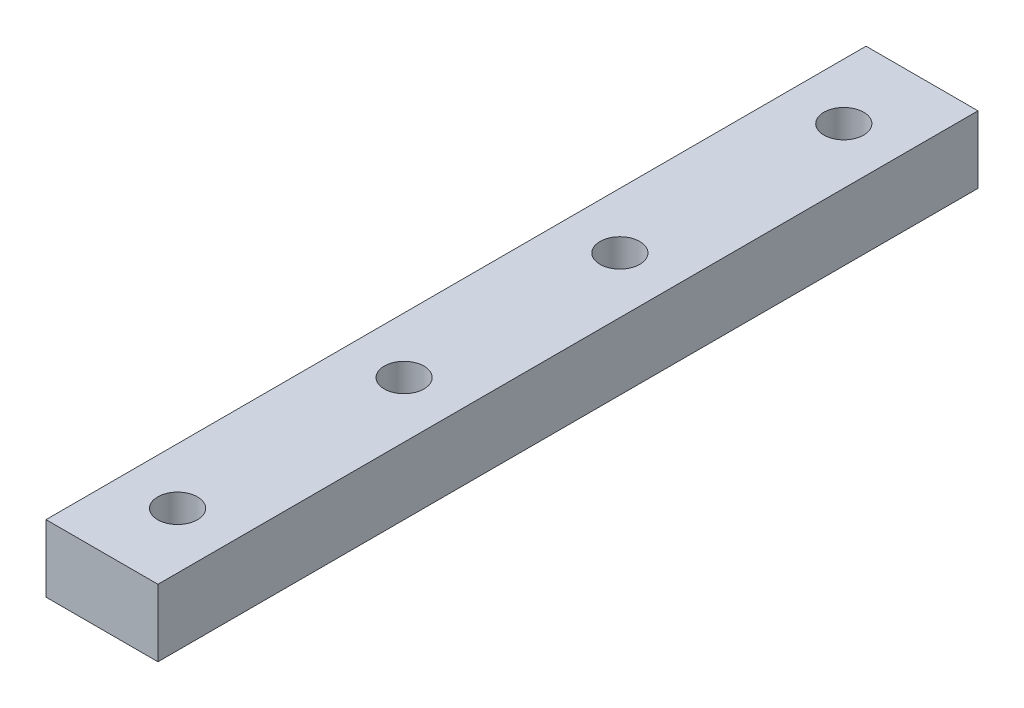
ISO-10303-21;
HEADER;
FILE_DESCRIPTION(('STEP AP214'),'2;1');
FILE_NAME('part.step','',(''),(''),'','','');
FILE_SCHEMA(('AUTOMOTIVE_DESIGN { 1 0 10303 214 1 1 1 1 }'));
ENDSEC;
DATA;
#1=APPLICATION_CONTEXT('core data for automotive mechanical design processes');
#2=APPLICATION_PROTOCOL_DEFINITION('international standard','automotive_design',2000,#1);
#3=PRODUCT_CONTEXT('',#1,'mechanical');
#4=PRODUCT('Part','Part','',(#3));
#5=PRODUCT_RELATED_PRODUCT_CATEGORY('part','',(#4));
#6=PRODUCT_DEFINITION_FORMATION('','',#4);
#7=PRODUCT_DEFINITION_CONTEXT('part definition',#1,'design');
#8=PRODUCT_DEFINITION('design','',#6,#7);
#9=PRODUCT_DEFINITION_SHAPE('','',#8);
#10=(LENGTH_UNIT() NAMED_UNIT(*) SI_UNIT(.MILLI.,.METRE.));
#11=(NAMED_UNIT(*) PLANE_ANGLE_UNIT() SI_UNIT($,.RADIAN.));
#12=(NAMED_UNIT(*) SI_UNIT($,.STERADIAN.) SOLID_ANGLE_UNIT());
#13=UNCERTAINTY_MEASURE_WITH_UNIT(LENGTH_MEASURE(1.E-05),#10,'distance_accuracy_value','');
#14=(GEOMETRIC_REPRESENTATION_CONTEXT(3) GLOBAL_UNCERTAINTY_ASSIGNED_CONTEXT((#13)) GLOBAL_UNIT_ASSIGNED_CONTEXT((#10,
#11,#12)) REPRESENTATION_CONTEXT('',''));
#15=CARTESIAN_POINT('',(0.,0.,0.));
#16=DIRECTION('',(0.,0.,1.));
#17=DIRECTION('',(1.,0.,0.));
#18=AXIS2_PLACEMENT_3D('',#15,#16,#17);
#19=CARTESIAN_POINT('',(-10.,12.,-73.25));
#20=DIRECTION('',(1.,0.,0.));
#21=DIRECTION('',(0.,0.,-1.));
#22=AXIS2_PLACEMENT_3D('',#19,#20,#21);
#23=PLANE('',#22);
#24=DIRECTION('',(0.,0.,1.));
#25=VECTOR('',#24,1.);
#26=CARTESIAN_POINT('',(-10.,0.,-73.25));
#27=LINE('',#26,#25);
#28=CARTESIAN_POINT('',(-10.,0.,-73.25));
#29=VERTEX_POINT('',#28);
#30=CARTESIAN_POINT('',(-9.99999999999999,0.,73.25));
#31=VERTEX_POINT('',#30);
#32=EDGE_CURVE('E97',#29,#31,#27,.T.);
#33=ORIENTED_EDGE('',*,*,#32,.T.);
#34=DIRECTION('',(0.,-1.,0.));
#35=VECTOR('',#34,1.);
#36=CARTESIAN_POINT('',(-9.99999999999999,12.,73.25));
#37=LINE('',#36,#35);
#38=CARTESIAN_POINT('',(-9.99999999999999,12.,73.25));
#39=VERTEX_POINT('',#38);
#40=EDGE_CURVE('E11',#39,#31,#37,.T.);
#41=ORIENTED_EDGE('',*,*,#40,.F.);
#42=DIRECTION('',(0.,0.,1.));
#43=VECTOR('',#42,1.);
#44=CARTESIAN_POINT('',(-10.,12.,-73.25));
#45=LINE('',#44,#43);
#46=CARTESIAN_POINT('',(-10.,12.,-73.25));
#47=VERTEX_POINT('',#46);
#48=EDGE_CURVE('E85',#47,#39,#45,.T.);
#49=ORIENTED_EDGE('',*,*,#48,.F.);
#50=DIRECTION('',(0.,-1.,0.));
#51=VECTOR('',#50,1.);
#52=CARTESIAN_POINT('',(-10.,12.,-73.25));
#53=LINE('',#52,#51);
#54=EDGE_CURVE('E93',#47,#29,#53,.T.);
#55=ORIENTED_EDGE('',*,*,#54,.T.);
#56=EDGE_LOOP('',(#33,#41,#49,#55));
#57=FACE_BOUND('',#56,.T.);
#58=ADVANCED_FACE('F34',(#57),#23,.F.);
#59=CARTESIAN_POINT('',(-9.99999999999999,12.,73.25));
#60=DIRECTION('',(0.,0.,-1.));
#61=DIRECTION('',(-1.,0.,0.));
#62=AXIS2_PLACEMENT_3D('',#59,#60,#61);
#63=PLANE('',#62);
#64=DIRECTION('',(1.,0.,0.));
#65=VECTOR('',#64,1.);
#66=CARTESIAN_POINT('',(-9.99999999999999,0.,73.25));
#67=LINE('',#66,#65);
#68=CARTESIAN_POINT('',(10.,0.,73.25));
#69=VERTEX_POINT('',#68);
#70=EDGE_CURVE('E89',#31,#69,#67,.T.);
#71=ORIENTED_EDGE('',*,*,#70,.T.);
#72=DIRECTION('',(0.,-1.,0.));
#73=VECTOR('',#72,1.);
#74=CARTESIAN_POINT('',(10.,12.,73.25));
#75=LINE('',#74,#73);
#76=CARTESIAN_POINT('',(10.,12.,73.25));
#77=VERTEX_POINT('',#76);
#78=EDGE_CURVE('E42',#77,#69,#75,.T.);
#79=ORIENTED_EDGE('',*,*,#78,.F.);
#80=DIRECTION('',(1.,0.,0.));
#81=VECTOR('',#80,1.);
#82=CARTESIAN_POINT('',(-9.99999999999999,12.,73.25));
#83=LINE('',#82,#81);
#84=EDGE_CURVE('E80',#39,#77,#83,.T.);
#85=ORIENTED_EDGE('',*,*,#84,.F.);
#86=ORIENTED_EDGE('',*,*,#40,.T.);
#87=EDGE_LOOP('',(#71,#79,#85,#86));
#88=FACE_BOUND('',#87,.T.);
#89=ADVANCED_FACE('F88',(#88),#63,.F.);
#90=CARTESIAN_POINT('',(9.99999999999999,12.,-73.25));
#91=DIRECTION('',(-1.,0.,0.));
#92=DIRECTION('',(0.,0.,1.));
#93=AXIS2_PLACEMENT_3D('',#90,#91,#92);
#94=PLANE('',#93);
#95=DIRECTION('',(0.,0.,-1.));
#96=VECTOR('',#95,1.);
#97=CARTESIAN_POINT('',(9.99999999999999,0.,-73.25));
#98=LINE('',#97,#96);
#99=CARTESIAN_POINT('',(9.99999999999999,0.,-73.25));
#100=VERTEX_POINT('',#99);
#101=EDGE_CURVE('E67',#69,#100,#98,.T.);
#102=ORIENTED_EDGE('',*,*,#101,.T.);
#103=DIRECTION('',(0.,-1.,0.));
#104=VECTOR('',#103,1.);
#105=CARTESIAN_POINT('',(9.99999999999999,12.,-73.25));
#106=LINE('',#105,#104);
#107=CARTESIAN_POINT('',(9.99999999999999,12.,-73.25));
#108=VERTEX_POINT('',#107);
#109=EDGE_CURVE('E90',#108,#100,#106,.T.);
#110=ORIENTED_EDGE('',*,*,#109,.F.);
#111=DIRECTION('',(0.,0.,-1.));
#112=VECTOR('',#111,1.);
#113=CARTESIAN_POINT('',(9.99999999999999,12.,-73.25));
#114=LINE('',#113,#112);
#115=EDGE_CURVE('E83',#77,#108,#114,.T.);
#116=ORIENTED_EDGE('',*,*,#115,.F.);
#117=ORIENTED_EDGE('',*,*,#78,.T.);
#118=EDGE_LOOP('',(#102,#110,#116,#117));
#119=FACE_BOUND('',#118,.T.);
#120=ADVANCED_FACE('F91',(#119),#94,.F.);
#121=CARTESIAN_POINT('',(-10.,12.,-73.25));
#122=DIRECTION('',(0.,0.,1.));
#123=DIRECTION('',(1.,0.,0.));
#124=AXIS2_PLACEMENT_3D('',#121,#122,#123);
#125=PLANE('',#124);
#126=DIRECTION('',(-1.,0.,0.));
#127=VECTOR('',#126,1.);
#128=CARTESIAN_POINT('',(-10.,0.,-73.25));
#129=LINE('',#128,#127);
#130=EDGE_CURVE('E73',#100,#29,#129,.T.);
#131=ORIENTED_EDGE('',*,*,#130,.T.);
#132=ORIENTED_EDGE('',*,*,#54,.F.);
#133=DIRECTION('',(-1.,0.,0.));
#134=VECTOR('',#133,1.);
#135=CARTESIAN_POINT('',(-10.,12.,-73.25));
#136=LINE('',#135,#134);
#137=EDGE_CURVE('E50',#108,#47,#136,.T.);
#138=ORIENTED_EDGE('',*,*,#137,.F.);
#139=ORIENTED_EDGE('',*,*,#109,.T.);
#140=EDGE_LOOP('',(#131,#132,#138,#139));
#141=FACE_BOUND('',#140,.T.);
#142=ADVANCED_FACE('F105',(#141),#125,.F.);
#143=CARTESIAN_POINT('',(0.,12.,0.));
#144=DIRECTION('',(0.,1.,0.));
#145=DIRECTION('',(0.,0.,1.));
#146=AXIS2_PLACEMENT_3D('',#143,#144,#145);
#147=PLANE('',#146);
#148=CARTESIAN_POINT('',(0.,12.,-59.275));
#149=DIRECTION('',(0.,1.,0.));
#150=DIRECTION('',(0.,0.,1.));
#151=AXIS2_PLACEMENT_3D('',#148,#149,#150);
#152=CIRCLE('',#151,3.55);
#153=CARTESIAN_POINT('',(0.,12.,-55.725));
#154=VERTEX_POINT('',#153);
#155=EDGE_CURVE('E131',#154,#154,#152,.T.);
#156=ORIENTED_EDGE('',*,*,#155,.F.);
#157=EDGE_LOOP('',(#156));
#158=FACE_BOUND('',#157,.T.);
#159=CARTESIAN_POINT('',(0.,12.,-19.275));
#160=DIRECTION('',(0.,1.,0.));
#161=DIRECTION('',(0.,0.,1.));
#162=AXIS2_PLACEMENT_3D('',#159,#160,#161);
#163=CIRCLE('',#162,3.55);
#164=CARTESIAN_POINT('',(0.,12.,-15.725));
#165=VERTEX_POINT('',#164);
#166=EDGE_CURVE('E125',#165,#165,#163,.T.);
#167=ORIENTED_EDGE('',*,*,#166,.F.);
#168=EDGE_LOOP('',(#167));
#169=FACE_BOUND('',#168,.T.);
#170=CARTESIAN_POINT('',(0.,12.,19.275));
#171=DIRECTION('',(0.,1.,0.));
#172=DIRECTION('',(0.,0.,1.));
#173=AXIS2_PLACEMENT_3D('',#170,#171,#172);
#174=CIRCLE('',#173,3.55);
#175=CARTESIAN_POINT('',(0.,12.,22.825));
#176=VERTEX_POINT('',#175);
#177=EDGE_CURVE('E119',#176,#176,#174,.T.);
#178=ORIENTED_EDGE('',*,*,#177,.F.);
#179=EDGE_LOOP('',(#178));
#180=FACE_BOUND('',#179,.T.);
#181=CARTESIAN_POINT('',(0.,12.,59.745));
#182=DIRECTION('',(0.,1.,0.));
#183=DIRECTION('',(0.,0.,1.));
#184=AXIS2_PLACEMENT_3D('',#181,#182,#183);
#185=CIRCLE('',#184,3.55);
#186=CARTESIAN_POINT('',(0.,12.,63.295));
#187=VERTEX_POINT('',#186);
#188=EDGE_CURVE('E113',#187,#187,#185,.T.);
#189=ORIENTED_EDGE('',*,*,#188,.F.);
#190=EDGE_LOOP('',(#189));
#191=FACE_BOUND('',#190,.T.);
#192=ORIENTED_EDGE('',*,*,#48,.T.);
#193=ORIENTED_EDGE('',*,*,#84,.T.);
#194=ORIENTED_EDGE('',*,*,#115,.T.);
#195=ORIENTED_EDGE('',*,*,#137,.T.);
#196=EDGE_LOOP('',(#192,#193,#194,#195));
#197=FACE_BOUND('',#196,.T.);
#198=ADVANCED_FACE('F81',(#158,#169,#180,#191,#197),#147,.T.);
#199=CARTESIAN_POINT('',(0.,0.,0.));
#200=DIRECTION('',(0.,1.,0.));
#201=DIRECTION('',(0.,0.,1.));
#202=AXIS2_PLACEMENT_3D('',#199,#200,#201);
#203=PLANE('',#202);
#204=CARTESIAN_POINT('',(0.,0.,-59.275));
#205=DIRECTION('',(0.,1.,0.));
#206=DIRECTION('',(0.,0.,1.));
#207=AXIS2_PLACEMENT_3D('',#204,#205,#206);
#208=CIRCLE('',#207,3.54999999999999);
#209=CARTESIAN_POINT('',(0.,0.,-55.725));
#210=VERTEX_POINT('',#209);
#211=EDGE_CURVE('E128',#210,#210,#208,.T.);
#212=ORIENTED_EDGE('',*,*,#211,.T.);
#213=EDGE_LOOP('',(#212));
#214=FACE_BOUND('',#213,.T.);
#215=CARTESIAN_POINT('',(0.,0.,-19.275));
#216=DIRECTION('',(0.,1.,0.));
#217=DIRECTION('',(0.,0.,1.));
#218=AXIS2_PLACEMENT_3D('',#215,#216,#217);
#219=CIRCLE('',#218,3.54999999999999);
#220=CARTESIAN_POINT('',(0.,0.,-15.725));
#221=VERTEX_POINT('',#220);
#222=EDGE_CURVE('E122',#221,#221,#219,.T.);
#223=ORIENTED_EDGE('',*,*,#222,.T.);
#224=EDGE_LOOP('',(#223));
#225=FACE_BOUND('',#224,.T.);
#226=CARTESIAN_POINT('',(0.,0.,19.275));
#227=DIRECTION('',(0.,1.,0.));
#228=DIRECTION('',(0.,0.,1.));
#229=AXIS2_PLACEMENT_3D('',#226,#227,#228);
#230=CIRCLE('',#229,3.54999999999999);
#231=CARTESIAN_POINT('',(0.,0.,22.825));
#232=VERTEX_POINT('',#231);
#233=EDGE_CURVE('E116',#232,#232,#230,.T.);
#234=ORIENTED_EDGE('',*,*,#233,.T.);
#235=EDGE_LOOP('',(#234));
#236=FACE_BOUND('',#235,.T.);
#237=CARTESIAN_POINT('',(0.,0.,59.745));
#238=DIRECTION('',(0.,1.,0.));
#239=DIRECTION('',(0.,0.,1.));
#240=AXIS2_PLACEMENT_3D('',#237,#238,#239);
#241=CIRCLE('',#240,3.54999999999999);
#242=CARTESIAN_POINT('',(0.,0.,63.295));
#243=VERTEX_POINT('',#242);
#244=EDGE_CURVE('E100',#243,#243,#241,.T.);
#245=ORIENTED_EDGE('',*,*,#244,.T.);
#246=EDGE_LOOP('',(#245));
#247=FACE_BOUND('',#246,.T.);
#248=ORIENTED_EDGE('',*,*,#32,.F.);
#249=ORIENTED_EDGE('',*,*,#130,.F.);
#250=ORIENTED_EDGE('',*,*,#101,.F.);
#251=ORIENTED_EDGE('',*,*,#70,.F.);
#252=EDGE_LOOP('',(#248,#249,#250,#251));
#253=FACE_BOUND('',#252,.T.);
#254=ADVANCED_FACE('F108',(#214,#225,#236,#247,#253),#203,.F.);
#255=CARTESIAN_POINT('',(0.,12.,59.745));
#256=DIRECTION('',(0.,1.,0.));
#257=DIRECTION('',(0.,0.,1.));
#258=AXIS2_PLACEMENT_3D('',#255,#256,#257);
#259=CYLINDRICAL_SURFACE('',#258,3.55);
#260=ORIENTED_EDGE('',*,*,#244,.F.);
#261=EDGE_LOOP('',(#260));
#262=FACE_BOUND('',#261,.T.);
#263=ORIENTED_EDGE('',*,*,#188,.T.);
#264=EDGE_LOOP('',(#263));
#265=FACE_BOUND('',#264,.T.);
#266=ADVANCED_FACE('F146',(#262,#265),#259,.F.);
#267=CARTESIAN_POINT('',(0.,12.,19.275));
#268=DIRECTION('',(0.,1.,0.));
#269=DIRECTION('',(0.,0.,1.));
#270=AXIS2_PLACEMENT_3D('',#267,#268,#269);
#271=CYLINDRICAL_SURFACE('',#270,3.55);
#272=ORIENTED_EDGE('',*,*,#233,.F.);
#273=EDGE_LOOP('',(#272));
#274=FACE_BOUND('',#273,.T.);
#275=ORIENTED_EDGE('',*,*,#177,.T.);
#276=EDGE_LOOP('',(#275));
#277=FACE_BOUND('',#276,.T.);
#278=ADVANCED_FACE('F148',(#274,#277),#271,.F.);
#279=CARTESIAN_POINT('',(0.,12.,-19.275));
#280=DIRECTION('',(0.,1.,0.));
#281=DIRECTION('',(0.,0.,1.));
#282=AXIS2_PLACEMENT_3D('',#279,#280,#281);
#283=CYLINDRICAL_SURFACE('',#282,3.55);
#284=ORIENTED_EDGE('',*,*,#222,.F.);
#285=EDGE_LOOP('',(#284));
#286=FACE_BOUND('',#285,.T.);
#287=ORIENTED_EDGE('',*,*,#166,.T.);
#288=EDGE_LOOP('',(#287));
#289=FACE_BOUND('',#288,.T.);
#290=ADVANCED_FACE('F155',(#286,#289),#283,.F.);
#291=CARTESIAN_POINT('',(0.,12.,-59.275));
#292=DIRECTION('',(0.,1.,0.));
#293=DIRECTION('',(0.,0.,1.));
#294=AXIS2_PLACEMENT_3D('',#291,#292,#293);
#295=CYLINDRICAL_SURFACE('',#294,3.55);
#296=ORIENTED_EDGE('',*,*,#211,.F.);
#297=EDGE_LOOP('',(#296));
#298=FACE_BOUND('',#297,.T.);
#299=ORIENTED_EDGE('',*,*,#155,.T.);
#300=EDGE_LOOP('',(#299));
#301=FACE_BOUND('',#300,.T.);
#302=ADVANCED_FACE('F135',(#298,#301),#295,.F.);
#303=CLOSED_SHELL('',(#58,#89,#120,#142,#198,#254,#266,#278,#290,#302));
#304=MANIFOLD_SOLID_BREP('B2',#303);
#305=ADVANCED_BREP_SHAPE_REPRESENTATION('',(#18,#304),#14);
#306=SHAPE_DEFINITION_REPRESENTATION(#9,#305);
ENDSEC;
END-ISO-10303-21;
